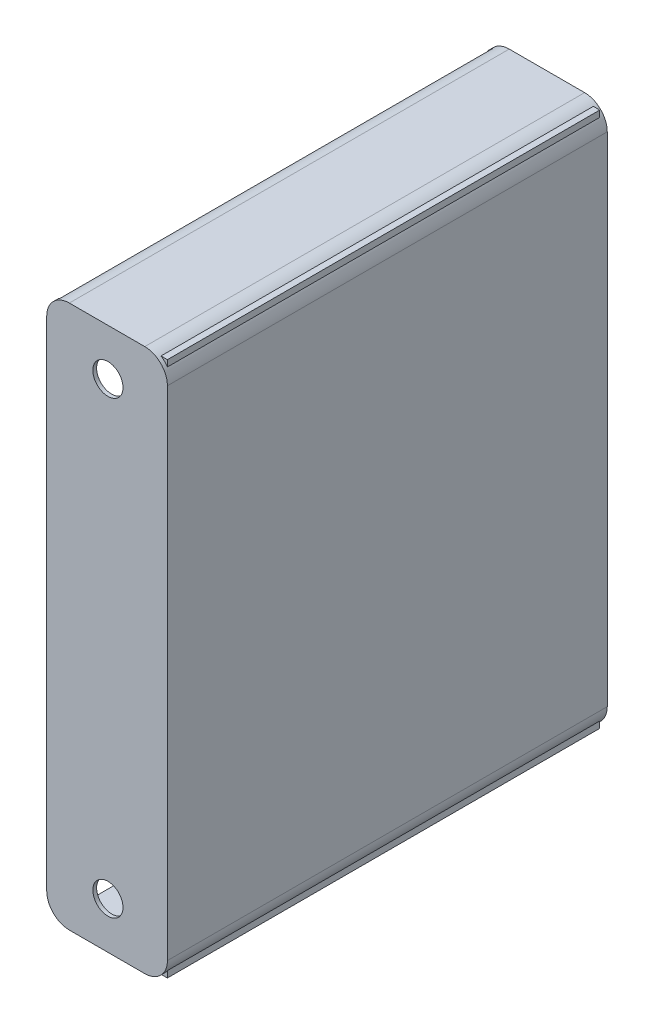
ISO-10303-21;
HEADER;
FILE_DESCRIPTION(('STEP AP214'),'2;1');
FILE_NAME('part.step','',(''),(''),'','','');
FILE_SCHEMA(('AUTOMOTIVE_DESIGN { 1 0 10303 214 1 1 1 1 }'));
ENDSEC;
DATA;
#1=APPLICATION_CONTEXT('core data for automotive mechanical design processes');
#2=APPLICATION_PROTOCOL_DEFINITION('international standard','automotive_design',2000,#1);
#3=PRODUCT_CONTEXT('',#1,'mechanical');
#4=PRODUCT('Part','Part','',(#3));
#5=PRODUCT_RELATED_PRODUCT_CATEGORY('part','',(#4));
#6=PRODUCT_DEFINITION_FORMATION('','',#4);
#7=PRODUCT_DEFINITION_CONTEXT('part definition',#1,'design');
#8=PRODUCT_DEFINITION('design','',#6,#7);
#9=PRODUCT_DEFINITION_SHAPE('','',#8);
#10=(LENGTH_UNIT() NAMED_UNIT(*) SI_UNIT(.MILLI.,.METRE.));
#11=(NAMED_UNIT(*) PLANE_ANGLE_UNIT() SI_UNIT($,.RADIAN.));
#12=(NAMED_UNIT(*) SI_UNIT($,.STERADIAN.) SOLID_ANGLE_UNIT());
#13=UNCERTAINTY_MEASURE_WITH_UNIT(LENGTH_MEASURE(1.E-05),#10,'distance_accuracy_value','');
#14=(GEOMETRIC_REPRESENTATION_CONTEXT(3) GLOBAL_UNCERTAINTY_ASSIGNED_CONTEXT((#13)) GLOBAL_UNIT_ASSIGNED_CONTEXT((#10,
#11,#12)) REPRESENTATION_CONTEXT('',''));
#15=CARTESIAN_POINT('',(0.,0.,0.));
#16=DIRECTION('',(0.,0.,1.));
#17=DIRECTION('',(1.,0.,0.));
#18=AXIS2_PLACEMENT_3D('',#15,#16,#17);
#19=CARTESIAN_POINT('',(62.8886512947952,1.10627258317078E-13,0.));
#20=DIRECTION('',(1.,0.,0.));
#21=DIRECTION('',(0.,0.,-1.));
#22=AXIS2_PLACEMENT_3D('',#19,#20,#21);
#23=PLANE('',#22);
#24=DIRECTION('',(0.,1.,0.));
#25=VECTOR('',#24,1.);
#26=CARTESIAN_POINT('',(62.8886512947952,-268.23924,-217.2737844));
#27=LINE('',#26,#25);
#28=CARTESIAN_POINT('',(62.8886512947952,-245.88597,-217.2737844));
#29=VERTEX_POINT('',#28);
#30=CARTESIAN_POINT('',(62.8886512947952,245.88597,-217.2737844));
#31=VERTEX_POINT('',#30);
#32=EDGE_CURVE('E157',#29,#31,#27,.T.);
#33=ORIENTED_EDGE('',*,*,#32,.F.);
#34=DIRECTION('',(0.,0.,-1.));
#35=VECTOR('',#34,1.);
#36=CARTESIAN_POINT('',(62.8886512947952,-245.88597,0.));
#37=LINE('',#36,#35);
#38=CARTESIAN_POINT('',(62.8886512947952,-245.88597,-213.5482394));
#39=VERTEX_POINT('',#38);
#40=EDGE_CURVE('E239',#29,#39,#37,.F.);
#41=ORIENTED_EDGE('',*,*,#40,.T.);
#42=DIRECTION('',(0.,1.,0.));
#43=VECTOR('',#42,1.);
#44=CARTESIAN_POINT('',(62.8886512947952,-268.23924,-213.5482394));
#45=LINE('',#44,#43);
#46=CARTESIAN_POINT('',(62.8886512947952,245.88597,-213.5482394));
#47=VERTEX_POINT('',#46);
#48=EDGE_CURVE('E150',#39,#47,#45,.T.);
#49=ORIENTED_EDGE('',*,*,#48,.T.);
#50=DIRECTION('',(0.,0.,1.));
#51=VECTOR('',#50,1.);
#52=CARTESIAN_POINT('',(62.8886512947952,245.88597,1.09379622367557E-13));
#53=LINE('',#52,#51);
#54=EDGE_CURVE('E233',#47,#31,#53,.F.);
#55=ORIENTED_EDGE('',*,*,#54,.T.);
#56=EDGE_LOOP('',(#33,#41,#49,#55));
#57=FACE_BOUND('',#56,.T.);
#58=ADVANCED_FACE('F34',(#57),#23,.F.);
#59=CARTESIAN_POINT('',(182.106091294795,-268.23924,217.2737844));
#60=DIRECTION('',(0.,0.,-1.));
#61=DIRECTION('',(-1.,0.,0.));
#62=AXIS2_PLACEMENT_3D('',#59,#60,#61);
#63=PLANE('',#62);
#64=CARTESIAN_POINT('',(123.343846034914,-222.355899960403,217.2737844));
#65=DIRECTION('',(0.,0.,-1.));
#66=DIRECTION('',(1.,0.,0.));
#67=AXIS2_PLACEMENT_3D('',#64,#65,#66);
#68=CIRCLE('',#67,14.90218);
#69=CARTESIAN_POINT('',(138.246026034914,-222.355899960403,217.2737844));
#70=VERTEX_POINT('',#69);
#71=EDGE_CURVE('E206',#70,#70,#68,.T.);
#72=ORIENTED_EDGE('',*,*,#71,.T.);
#73=EDGE_LOOP('',(#72));
#74=FACE_BOUND('',#73,.T.);
#75=CARTESIAN_POINT('',(123.343846034914,222.355899960404,217.2737844));
#76=DIRECTION('',(0.,0.,1.));
#77=DIRECTION('',(1.,0.,0.));
#78=AXIS2_PLACEMENT_3D('',#75,#76,#77);
#79=CIRCLE('',#78,14.90218);
#80=CARTESIAN_POINT('',(138.246026034914,222.355899960404,217.2737844));
#81=VERTEX_POINT('',#80);
#82=EDGE_CURVE('E201',#81,#81,#79,.T.);
#83=ORIENTED_EDGE('',*,*,#82,.F.);
#84=EDGE_LOOP('',(#83));
#85=FACE_BOUND('',#84,.T.);
#86=DIRECTION('',(-1.,0.,0.));
#87=VECTOR('',#86,1.);
#88=CARTESIAN_POINT('',(182.106091294795,-268.23924,217.2737844));
#89=LINE('',#88,#87);
#90=CARTESIAN_POINT('',(159.752821294795,-268.23924,217.2737844));
#91=VERTEX_POINT('',#90);
#92=CARTESIAN_POINT('',(85.2419212947952,-268.23924,217.2737844));
#93=VERTEX_POINT('',#92);
#94=EDGE_CURVE('E193',#91,#93,#89,.T.);
#95=ORIENTED_EDGE('',*,*,#94,.F.);
#96=CARTESIAN_POINT('',(159.752821294795,-245.88597,217.2737844));
#97=DIRECTION('',(0.,0.,-1.));
#98=DIRECTION('',(-1.,0.,0.));
#99=AXIS2_PLACEMENT_3D('',#96,#97,#98);
#100=CIRCLE('',#99,22.35327);
#101=CARTESIAN_POINT('',(182.106091294795,-245.88597,217.2737844));
#102=VERTEX_POINT('',#101);
#103=EDGE_CURVE('E231',#91,#102,#100,.F.);
#104=ORIENTED_EDGE('',*,*,#103,.T.);
#105=DIRECTION('',(0.,-1.,0.));
#106=VECTOR('',#105,1.);
#107=CARTESIAN_POINT('',(182.106091294795,-268.23924,217.2737844));
#108=LINE('',#107,#106);
#109=CARTESIAN_POINT('',(182.106091294795,245.88597,217.2737844));
#110=VERTEX_POINT('',#109);
#111=EDGE_CURVE('E176',#110,#102,#108,.T.);
#112=ORIENTED_EDGE('',*,*,#111,.F.);
#113=CARTESIAN_POINT('',(159.752821294795,245.88597,217.2737844));
#114=DIRECTION('',(0.,0.,-1.));
#115=DIRECTION('',(-1.,0.,0.));
#116=AXIS2_PLACEMENT_3D('',#113,#114,#115);
#117=CIRCLE('',#116,22.35327);
#118=CARTESIAN_POINT('',(159.752821294795,268.23924,217.2737844));
#119=VERTEX_POINT('',#118);
#120=EDGE_CURVE('E227',#110,#119,#117,.F.);
#121=ORIENTED_EDGE('',*,*,#120,.T.);
#122=DIRECTION('',(-1.,0.,0.));
#123=VECTOR('',#122,1.);
#124=CARTESIAN_POINT('',(182.106091294795,268.23924,217.2737844));
#125=LINE('',#124,#123);
#126=CARTESIAN_POINT('',(85.2419212947952,268.23924,217.2737844));
#127=VERTEX_POINT('',#126);
#128=EDGE_CURVE('E181',#119,#127,#125,.T.);
#129=ORIENTED_EDGE('',*,*,#128,.T.);
#130=CARTESIAN_POINT('',(85.2419212947952,245.88597,217.2737844));
#131=DIRECTION('',(0.,0.,-1.));
#132=DIRECTION('',(-1.,0.,0.));
#133=AXIS2_PLACEMENT_3D('',#130,#131,#132);
#134=CIRCLE('',#133,22.35327);
#135=CARTESIAN_POINT('',(62.8886512947952,245.88597,217.2737844));
#136=VERTEX_POINT('',#135);
#137=EDGE_CURVE('E225',#127,#136,#134,.F.);
#138=ORIENTED_EDGE('',*,*,#137,.T.);
#139=DIRECTION('',(0.,-1.,0.));
#140=VECTOR('',#139,1.);
#141=CARTESIAN_POINT('',(62.8886512947952,-268.23924,217.2737844));
#142=LINE('',#141,#140);
#143=CARTESIAN_POINT('',(62.8886512947952,-245.88597,217.2737844));
#144=VERTEX_POINT('',#143);
#145=EDGE_CURVE('E153',#136,#144,#142,.T.);
#146=ORIENTED_EDGE('',*,*,#145,.T.);
#147=CARTESIAN_POINT('',(85.2419212947952,-245.88597,217.2737844));
#148=DIRECTION('',(0.,0.,-1.));
#149=DIRECTION('',(-1.,0.,0.));
#150=AXIS2_PLACEMENT_3D('',#147,#148,#149);
#151=CIRCLE('',#150,22.35327);
#152=EDGE_CURVE('E229',#144,#93,#151,.F.);
#153=ORIENTED_EDGE('',*,*,#152,.T.);
#154=EDGE_LOOP('',(#95,#104,#112,#121,#129,#138,#146,#153));
#155=FACE_BOUND('',#154,.T.);
#156=ADVANCED_FACE('F271',(#74,#85,#155),#63,.F.);
#157=CARTESIAN_POINT('',(182.106091294795,-268.23924,-217.2737844));
#158=DIRECTION('',(0.,1.,0.));
#159=DIRECTION('',(0.,0.,1.));
#160=AXIS2_PLACEMENT_3D('',#157,#158,#159);
#161=PLANE('',#160);
#162=DIRECTION('',(-1.,0.,0.));
#163=VECTOR('',#162,1.);
#164=CARTESIAN_POINT('',(182.106091294795,-268.23924,-217.2737844));
#165=LINE('',#164,#163);
#166=CARTESIAN_POINT('',(159.752821294795,-268.23924,-217.2737844));
#167=VERTEX_POINT('',#166);
#168=CARTESIAN_POINT('',(85.2419212947952,-268.23924,-217.2737844));
#169=VERTEX_POINT('',#168);
#170=EDGE_CURVE('E190',#167,#169,#165,.T.);
#171=ORIENTED_EDGE('',*,*,#170,.F.);
#172=DIRECTION('',(0.,0.,-1.));
#173=VECTOR('',#172,1.);
#174=CARTESIAN_POINT('',(159.752821294795,-268.23924,217.2737844));
#175=LINE('',#174,#173);
#176=EDGE_CURVE('E223',#167,#91,#175,.F.);
#177=ORIENTED_EDGE('',*,*,#176,.T.);
#178=ORIENTED_EDGE('',*,*,#94,.T.);
#179=DIRECTION('',(0.,0.,-1.));
#180=VECTOR('',#179,1.);
#181=CARTESIAN_POINT('',(85.2419212947952,-268.23924,-217.2737844));
#182=LINE('',#181,#180);
#183=EDGE_CURVE('E220',#93,#169,#182,.T.);
#184=ORIENTED_EDGE('',*,*,#183,.T.);
#185=EDGE_LOOP('',(#171,#177,#178,#184));
#186=FACE_BOUND('',#185,.T.);
#187=ADVANCED_FACE('F278',(#186),#161,.F.);
#188=CARTESIAN_POINT('',(182.106091294795,-268.23924,-217.2737844));
#189=DIRECTION('',(0.,0.,1.));
#190=DIRECTION('',(1.,0.,0.));
#191=AXIS2_PLACEMENT_3D('',#188,#189,#190);
#192=PLANE('',#191);
#193=CARTESIAN_POINT('',(123.343846034914,-222.355899960403,-217.2737844));
#194=DIRECTION('',(0.,0.,1.));
#195=DIRECTION('',(1.,0.,0.));
#196=AXIS2_PLACEMENT_3D('',#193,#194,#195);
#197=CIRCLE('',#196,14.90218);
#198=CARTESIAN_POINT('',(138.246026034914,-222.355899960403,-217.2737844));
#199=VERTEX_POINT('',#198);
#200=EDGE_CURVE('E358',#199,#199,#197,.F.);
#201=ORIENTED_EDGE('',*,*,#200,.F.);
#202=EDGE_LOOP('',(#201));
#203=FACE_BOUND('',#202,.T.);
#204=CARTESIAN_POINT('',(123.343846034914,222.355899960404,-217.2737844));
#205=DIRECTION('',(0.,0.,1.));
#206=DIRECTION('',(1.,0.,0.));
#207=AXIS2_PLACEMENT_3D('',#204,#205,#206);
#208=CIRCLE('',#207,14.90218);
#209=CARTESIAN_POINT('',(138.246026034914,222.355899960404,-217.2737844));
#210=VERTEX_POINT('',#209);
#211=EDGE_CURVE('E162',#210,#210,#208,.T.);
#212=ORIENTED_EDGE('',*,*,#211,.T.);
#213=EDGE_LOOP('',(#212));
#214=FACE_BOUND('',#213,.T.);
#215=DIRECTION('',(0.,1.,0.));
#216=VECTOR('',#215,1.);
#217=CARTESIAN_POINT('',(182.106091294795,-268.23924,-217.2737844));
#218=LINE('',#217,#216);
#219=CARTESIAN_POINT('',(182.106091294795,-245.88597,-217.2737844));
#220=VERTEX_POINT('',#219);
#221=CARTESIAN_POINT('',(182.106091294795,245.88597,-217.2737844));
#222=VERTEX_POINT('',#221);
#223=EDGE_CURVE('E179',#220,#222,#218,.T.);
#224=ORIENTED_EDGE('',*,*,#223,.F.);
#225=CARTESIAN_POINT('',(159.752821294795,-245.88597,-217.2737844));
#226=DIRECTION('',(0.,0.,1.));
#227=DIRECTION('',(1.,0.,0.));
#228=AXIS2_PLACEMENT_3D('',#225,#226,#227);
#229=CIRCLE('',#228,22.35327);
#230=EDGE_CURVE('E218',#220,#167,#229,.F.);
#231=ORIENTED_EDGE('',*,*,#230,.T.);
#232=ORIENTED_EDGE('',*,*,#170,.T.);
#233=CARTESIAN_POINT('',(85.2419212947952,-245.88597,-217.2737844));
#234=DIRECTION('',(0.,0.,1.));
#235=DIRECTION('',(1.,0.,0.));
#236=AXIS2_PLACEMENT_3D('',#233,#234,#235);
#237=CIRCLE('',#236,22.35327);
#238=EDGE_CURVE('E216',#169,#29,#237,.F.);
#239=ORIENTED_EDGE('',*,*,#238,.T.);
#240=ORIENTED_EDGE('',*,*,#32,.T.);
#241=CARTESIAN_POINT('',(85.2419212947952,245.88597,-217.2737844));
#242=DIRECTION('',(0.,0.,1.));
#243=DIRECTION('',(1.,0.,0.));
#244=AXIS2_PLACEMENT_3D('',#241,#242,#243);
#245=CIRCLE('',#244,22.35327);
#246=CARTESIAN_POINT('',(85.2419212947952,268.23924,-217.2737844));
#247=VERTEX_POINT('',#246);
#248=EDGE_CURVE('E212',#31,#247,#245,.F.);
#249=ORIENTED_EDGE('',*,*,#248,.T.);
#250=DIRECTION('',(-1.,0.,0.));
#251=VECTOR('',#250,1.);
#252=CARTESIAN_POINT('',(182.106091294795,268.23924,-217.2737844));
#253=LINE('',#252,#251);
#254=CARTESIAN_POINT('',(159.752821294795,268.23924,-217.2737844));
#255=VERTEX_POINT('',#254);
#256=EDGE_CURVE('E187',#255,#247,#253,.T.);
#257=ORIENTED_EDGE('',*,*,#256,.F.);
#258=CARTESIAN_POINT('',(159.752821294795,245.88597,-217.2737844));
#259=DIRECTION('',(0.,0.,1.));
#260=DIRECTION('',(1.,0.,0.));
#261=AXIS2_PLACEMENT_3D('',#258,#259,#260);
#262=CIRCLE('',#261,22.35327);
#263=EDGE_CURVE('E214',#255,#222,#262,.F.);
#264=ORIENTED_EDGE('',*,*,#263,.T.);
#265=EDGE_LOOP('',(#224,#231,#232,#239,#240,#249,#257,#264));
#266=FACE_BOUND('',#265,.T.);
#267=ADVANCED_FACE('F261',(#203,#214,#266),#192,.F.);
#268=CARTESIAN_POINT('',(182.106091294795,268.23924,-217.2737844));
#269=DIRECTION('',(0.,-1.,0.));
#270=DIRECTION('',(0.,0.,-1.));
#271=AXIS2_PLACEMENT_3D('',#268,#269,#270);
#272=PLANE('',#271);
#273=ORIENTED_EDGE('',*,*,#128,.F.);
#274=DIRECTION('',(0.,0.,1.));
#275=VECTOR('',#274,1.);
#276=CARTESIAN_POINT('',(159.752821294795,268.23924,-217.2737844));
#277=LINE('',#276,#275);
#278=EDGE_CURVE('E42',#119,#255,#277,.F.);
#279=ORIENTED_EDGE('',*,*,#278,.T.);
#280=ORIENTED_EDGE('',*,*,#256,.T.);
#281=DIRECTION('',(0.,0.,1.));
#282=VECTOR('',#281,1.);
#283=CARTESIAN_POINT('',(85.2419212947952,268.23924,-217.2737844));
#284=LINE('',#283,#282);
#285=EDGE_CURVE('E249',#247,#127,#284,.T.);
#286=ORIENTED_EDGE('',*,*,#285,.T.);
#287=EDGE_LOOP('',(#273,#279,#280,#286));
#288=FACE_BOUND('',#287,.T.);
#289=ADVANCED_FACE('F255',(#288),#272,.F.);
#290=CARTESIAN_POINT('',(182.106091294795,1.10627258317078E-13,0.));
#291=DIRECTION('',(1.,0.,0.));
#292=DIRECTION('',(0.,0.,-1.));
#293=AXIS2_PLACEMENT_3D('',#290,#291,#292);
#294=PLANE('',#293);
#295=ORIENTED_EDGE('',*,*,#111,.T.);
#296=DIRECTION('',(0.,0.,-1.));
#297=VECTOR('',#296,1.);
#298=CARTESIAN_POINT('',(182.106091294795,-245.88597,-217.2737844));
#299=LINE('',#298,#297);
#300=EDGE_CURVE('E209',#102,#220,#299,.T.);
#301=ORIENTED_EDGE('',*,*,#300,.T.);
#302=ORIENTED_EDGE('',*,*,#223,.T.);
#303=DIRECTION('',(0.,0.,1.));
#304=VECTOR('',#303,1.);
#305=CARTESIAN_POINT('',(182.106091294795,245.88597,217.2737844));
#306=LINE('',#305,#304);
#307=EDGE_CURVE('E196',#222,#110,#306,.T.);
#308=ORIENTED_EDGE('',*,*,#307,.T.);
#309=EDGE_LOOP('',(#295,#301,#302,#308));
#310=FACE_BOUND('',#309,.T.);
#311=ADVANCED_FACE('F267',(#310),#294,.T.);
#312=DIRECTION('',(0.,-1.,0.));
#313=VECTOR('',#312,1.);
#314=CARTESIAN_POINT('',(62.8886512947952,-268.23924,213.5482394));
#315=LINE('',#314,#313);
#316=CARTESIAN_POINT('',(62.8886512947952,245.88597,213.5482394));
#317=VERTEX_POINT('',#316);
#318=CARTESIAN_POINT('',(62.8886512947952,-245.88597,213.5482394));
#319=VERTEX_POINT('',#318);
#320=EDGE_CURVE('E171',#317,#319,#315,.T.);
#321=ORIENTED_EDGE('',*,*,#320,.T.);
#322=DIRECTION('',(0.,0.,-1.));
#323=VECTOR('',#322,1.);
#324=CARTESIAN_POINT('',(62.8886512947952,-245.88597,0.));
#325=LINE('',#324,#323);
#326=EDGE_CURVE('E237',#319,#144,#325,.F.);
#327=ORIENTED_EDGE('',*,*,#326,.T.);
#328=ORIENTED_EDGE('',*,*,#145,.F.);
#329=DIRECTION('',(0.,0.,1.));
#330=VECTOR('',#329,1.);
#331=CARTESIAN_POINT('',(62.8886512947952,245.88597,1.09379622367557E-13));
#332=LINE('',#331,#330);
#333=EDGE_CURVE('E235',#136,#317,#332,.F.);
#334=ORIENTED_EDGE('',*,*,#333,.T.);
#335=EDGE_LOOP('',(#321,#327,#328,#334));
#336=FACE_BOUND('',#335,.T.);
#337=ADVANCED_FACE('F296',(#336),#23,.F.);
#338=CARTESIAN_POINT('',(182.106091294795,-268.23924,213.5482394));
#339=DIRECTION('',(0.,0.,-1.));
#340=DIRECTION('',(-1.,0.,0.));
#341=AXIS2_PLACEMENT_3D('',#338,#339,#340);
#342=PLANE('',#341);
#343=CARTESIAN_POINT('',(123.343846034914,-222.355899960403,213.5482394));
#344=DIRECTION('',(0.,0.,-1.));
#345=DIRECTION('',(-1.,0.,0.));
#346=AXIS2_PLACEMENT_3D('',#343,#344,#345);
#347=CIRCLE('',#346,14.90218);
#348=CARTESIAN_POINT('',(108.441666034914,-222.355899960403,213.5482394));
#349=VERTEX_POINT('',#348);
#350=EDGE_CURVE('E205',#349,#349,#347,.F.);
#351=ORIENTED_EDGE('',*,*,#350,.T.);
#352=EDGE_LOOP('',(#351));
#353=FACE_BOUND('',#352,.T.);
#354=CARTESIAN_POINT('',(123.343846034914,222.355899960404,213.5482394));
#355=DIRECTION('',(0.,0.,-1.));
#356=DIRECTION('',(-1.,0.,0.));
#357=AXIS2_PLACEMENT_3D('',#354,#355,#356);
#358=CIRCLE('',#357,14.90218);
#359=CARTESIAN_POINT('',(108.441666034914,222.355899960404,213.5482394));
#360=VERTEX_POINT('',#359);
#361=EDGE_CURVE('E200',#360,#360,#358,.T.);
#362=ORIENTED_EDGE('',*,*,#361,.F.);
#363=EDGE_LOOP('',(#362));
#364=FACE_BOUND('',#363,.T.);
#365=DIRECTION('',(-1.,0.,0.));
#366=VECTOR('',#365,1.);
#367=CARTESIAN_POINT('',(182.106091294795,-264.513695,213.5482394));
#368=LINE('',#367,#366);
#369=CARTESIAN_POINT('',(178.380546294795,-264.513695,213.5482394));
#370=VERTEX_POINT('',#369);
#371=CARTESIAN_POINT('',(72.8856863902106,-264.513695,213.5482394));
#372=VERTEX_POINT('',#371);
#373=EDGE_CURVE('E147',#370,#372,#368,.T.);
#374=ORIENTED_EDGE('',*,*,#373,.T.);
#375=CARTESIAN_POINT('',(85.2419212947952,-245.88597,213.5482394));
#376=DIRECTION('',(0.,0.,-1.));
#377=DIRECTION('',(-1.,0.,0.));
#378=AXIS2_PLACEMENT_3D('',#375,#376,#377);
#379=CIRCLE('',#378,22.35327);
#380=EDGE_CURVE('E247',#372,#319,#379,.T.);
#381=ORIENTED_EDGE('',*,*,#380,.T.);
#382=ORIENTED_EDGE('',*,*,#320,.F.);
#383=CARTESIAN_POINT('',(85.2419212947952,245.88597,213.5482394));
#384=DIRECTION('',(0.,0.,-1.));
#385=DIRECTION('',(-1.,0.,0.));
#386=AXIS2_PLACEMENT_3D('',#383,#384,#385);
#387=CIRCLE('',#386,22.35327);
#388=CARTESIAN_POINT('',(72.8856863902105,264.513695,213.5482394));
#389=VERTEX_POINT('',#388);
#390=EDGE_CURVE('E49',#317,#389,#387,.T.);
#391=ORIENTED_EDGE('',*,*,#390,.T.);
#392=DIRECTION('',(-1.,0.,0.));
#393=VECTOR('',#392,1.);
#394=CARTESIAN_POINT('',(182.106091294795,264.513695,213.5482394));
#395=LINE('',#394,#393);
#396=CARTESIAN_POINT('',(178.380546294795,264.513695,213.5482394));
#397=VERTEX_POINT('',#396);
#398=EDGE_CURVE('E149',#397,#389,#395,.T.);
#399=ORIENTED_EDGE('',*,*,#398,.F.);
#400=DIRECTION('',(0.,-1.,0.));
#401=VECTOR('',#400,1.);
#402=CARTESIAN_POINT('',(178.380546294795,-268.23924,213.5482394));
#403=LINE('',#402,#401);
#404=EDGE_CURVE('E142',#397,#370,#403,.T.);
#405=ORIENTED_EDGE('',*,*,#404,.T.);
#406=EDGE_LOOP('',(#374,#381,#382,#391,#399,#405));
#407=FACE_BOUND('',#406,.T.);
#408=ADVANCED_FACE('F146',(#353,#364,#407),#342,.T.);
#409=CARTESIAN_POINT('',(182.106091294795,-264.513695,-217.2737844));
#410=DIRECTION('',(0.,1.,0.));
#411=DIRECTION('',(0.,0.,1.));
#412=AXIS2_PLACEMENT_3D('',#409,#410,#411);
#413=PLANE('',#412);
#414=DIRECTION('',(-1.,0.,0.));
#415=VECTOR('',#414,1.);
#416=CARTESIAN_POINT('',(182.106091294795,-264.513695,-213.5482394));
#417=LINE('',#416,#415);
#418=CARTESIAN_POINT('',(178.380546294795,-264.513695,-213.5482394));
#419=VERTEX_POINT('',#418);
#420=CARTESIAN_POINT('',(72.8856863902106,-264.513695,-213.5482394));
#421=VERTEX_POINT('',#420);
#422=EDGE_CURVE('E154',#419,#421,#417,.T.);
#423=ORIENTED_EDGE('',*,*,#422,.T.);
#424=DIRECTION('',(0.,0.,-1.));
#425=VECTOR('',#424,1.);
#426=CARTESIAN_POINT('',(72.8856863902106,-264.513695,-213.5482394));
#427=LINE('',#426,#425);
#428=EDGE_CURVE('E57',#421,#372,#427,.F.);
#429=ORIENTED_EDGE('',*,*,#428,.T.);
#430=ORIENTED_EDGE('',*,*,#373,.F.);
#431=DIRECTION('',(0.,0.,-1.));
#432=VECTOR('',#431,1.);
#433=CARTESIAN_POINT('',(178.380546294795,-264.513695,-217.2737844));
#434=LINE('',#433,#432);
#435=EDGE_CURVE('E138',#370,#419,#434,.T.);
#436=ORIENTED_EDGE('',*,*,#435,.T.);
#437=EDGE_LOOP('',(#423,#429,#430,#436));
#438=FACE_BOUND('',#437,.T.);
#439=ADVANCED_FACE('F152',(#438),#413,.T.);
#440=CARTESIAN_POINT('',(182.106091294795,-268.23924,-213.5482394));
#441=DIRECTION('',(0.,0.,1.));
#442=DIRECTION('',(1.,0.,0.));
#443=AXIS2_PLACEMENT_3D('',#440,#441,#442);
#444=PLANE('',#443);
#445=CARTESIAN_POINT('',(123.343846034914,-222.355899960403,-213.5482394));
#446=DIRECTION('',(0.,0.,1.));
#447=DIRECTION('',(1.,0.,0.));
#448=AXIS2_PLACEMENT_3D('',#445,#446,#447);
#449=CIRCLE('',#448,14.90218);
#450=CARTESIAN_POINT('',(138.246026034914,-222.355899960403,-213.5482394));
#451=VERTEX_POINT('',#450);
#452=EDGE_CURVE('E202',#451,#451,#449,.F.);
#453=ORIENTED_EDGE('',*,*,#452,.T.);
#454=EDGE_LOOP('',(#453));
#455=FACE_BOUND('',#454,.T.);
#456=CARTESIAN_POINT('',(123.343846034914,222.355899960404,-213.5482394));
#457=DIRECTION('',(0.,0.,1.));
#458=DIRECTION('',(1.,0.,0.));
#459=AXIS2_PLACEMENT_3D('',#456,#457,#458);
#460=CIRCLE('',#459,14.90218);
#461=CARTESIAN_POINT('',(138.246026034914,222.355899960404,-213.5482394));
#462=VERTEX_POINT('',#461);
#463=EDGE_CURVE('E197',#462,#462,#460,.T.);
#464=ORIENTED_EDGE('',*,*,#463,.F.);
#465=EDGE_LOOP('',(#464));
#466=FACE_BOUND('',#465,.T.);
#467=ORIENTED_EDGE('',*,*,#48,.F.);
#468=CARTESIAN_POINT('',(85.2419212947952,-245.88597,-213.5482394));
#469=DIRECTION('',(0.,0.,1.));
#470=DIRECTION('',(1.,0.,0.));
#471=AXIS2_PLACEMENT_3D('',#468,#469,#470);
#472=CIRCLE('',#471,22.35327);
#473=EDGE_CURVE('E243',#39,#421,#472,.T.);
#474=ORIENTED_EDGE('',*,*,#473,.T.);
#475=ORIENTED_EDGE('',*,*,#422,.F.);
#476=DIRECTION('',(0.,1.,0.));
#477=VECTOR('',#476,1.);
#478=CARTESIAN_POINT('',(178.380546294795,-268.23924,-213.5482394));
#479=LINE('',#478,#477);
#480=CARTESIAN_POINT('',(178.380546294795,264.513695,-213.5482394));
#481=VERTEX_POINT('',#480);
#482=EDGE_CURVE('E143',#419,#481,#479,.T.);
#483=ORIENTED_EDGE('',*,*,#482,.T.);
#484=DIRECTION('',(-1.,0.,0.));
#485=VECTOR('',#484,1.);
#486=CARTESIAN_POINT('',(182.106091294795,264.513695,-213.5482394));
#487=LINE('',#486,#485);
#488=CARTESIAN_POINT('',(72.8856863902106,264.513695,-213.5482394));
#489=VERTEX_POINT('',#488);
#490=EDGE_CURVE('E159',#481,#489,#487,.T.);
#491=ORIENTED_EDGE('',*,*,#490,.T.);
#492=CARTESIAN_POINT('',(85.2419212947952,245.88597,-213.5482394));
#493=DIRECTION('',(0.,0.,1.));
#494=DIRECTION('',(1.,0.,0.));
#495=AXIS2_PLACEMENT_3D('',#492,#493,#494);
#496=CIRCLE('',#495,22.35327);
#497=EDGE_CURVE('E241',#489,#47,#496,.T.);
#498=ORIENTED_EDGE('',*,*,#497,.T.);
#499=EDGE_LOOP('',(#467,#474,#475,#483,#491,#498));
#500=FACE_BOUND('',#499,.T.);
#501=ADVANCED_FACE('F301',(#455,#466,#500),#444,.T.);
#502=CARTESIAN_POINT('',(182.106091294795,264.513695,-217.2737844));
#503=DIRECTION('',(0.,-1.,0.));
#504=DIRECTION('',(0.,0.,-1.));
#505=AXIS2_PLACEMENT_3D('',#502,#503,#504);
#506=PLANE('',#505);
#507=ORIENTED_EDGE('',*,*,#398,.T.);
#508=DIRECTION('',(0.,0.,1.));
#509=VECTOR('',#508,1.);
#510=CARTESIAN_POINT('',(72.8856863902105,264.513695,213.5482394));
#511=LINE('',#510,#509);
#512=EDGE_CURVE('E11',#389,#489,#511,.F.);
#513=ORIENTED_EDGE('',*,*,#512,.T.);
#514=ORIENTED_EDGE('',*,*,#490,.F.);
#515=DIRECTION('',(0.,0.,1.));
#516=VECTOR('',#515,1.);
#517=CARTESIAN_POINT('',(178.380546294795,264.513695,-217.2737844));
#518=LINE('',#517,#516);
#519=EDGE_CURVE('E165',#481,#397,#518,.T.);
#520=ORIENTED_EDGE('',*,*,#519,.T.);
#521=EDGE_LOOP('',(#507,#513,#514,#520));
#522=FACE_BOUND('',#521,.T.);
#523=ADVANCED_FACE('F299',(#522),#506,.T.);
#524=CARTESIAN_POINT('',(178.380546294795,1.10627258317078E-13,0.));
#525=DIRECTION('',(1.,0.,0.));
#526=DIRECTION('',(0.,0.,-1.));
#527=AXIS2_PLACEMENT_3D('',#524,#525,#526);
#528=PLANE('',#527);
#529=ORIENTED_EDGE('',*,*,#404,.F.);
#530=ORIENTED_EDGE('',*,*,#519,.F.);
#531=ORIENTED_EDGE('',*,*,#482,.F.);
#532=ORIENTED_EDGE('',*,*,#435,.F.);
#533=EDGE_LOOP('',(#529,#530,#531,#532));
#534=FACE_BOUND('',#533,.T.);
#535=ADVANCED_FACE('F140',(#534),#528,.F.);
#536=CARTESIAN_POINT('',(123.343846034914,222.355899960404,-283.5884854));
#537=DIRECTION('',(0.,0.,1.));
#538=DIRECTION('',(1.,0.,0.));
#539=AXIS2_PLACEMENT_3D('',#536,#537,#538);
#540=CYLINDRICAL_SURFACE('',#539,14.90218);
#541=ORIENTED_EDGE('',*,*,#463,.T.);
#542=EDGE_LOOP('',(#541));
#543=FACE_BOUND('',#542,.T.);
#544=ORIENTED_EDGE('',*,*,#211,.F.);
#545=EDGE_LOOP('',(#544));
#546=FACE_BOUND('',#545,.T.);
#547=ADVANCED_FACE('F333',(#543,#546),#540,.F.);
#548=ORIENTED_EDGE('',*,*,#361,.T.);
#549=EDGE_LOOP('',(#548));
#550=FACE_BOUND('',#549,.T.);
#551=ORIENTED_EDGE('',*,*,#82,.T.);
#552=EDGE_LOOP('',(#551));
#553=FACE_BOUND('',#552,.T.);
#554=ADVANCED_FACE('F337',(#550,#553),#540,.F.);
#555=CARTESIAN_POINT('',(123.343846034914,-222.355899960403,-283.5884854));
#556=DIRECTION('',(0.,0.,1.));
#557=DIRECTION('',(1.,0.,0.));
#558=AXIS2_PLACEMENT_3D('',#555,#556,#557);
#559=CYLINDRICAL_SURFACE('',#558,14.90218);
#560=ORIENTED_EDGE('',*,*,#452,.F.);
#561=EDGE_LOOP('',(#560));
#562=FACE_BOUND('',#561,.T.);
#563=ORIENTED_EDGE('',*,*,#200,.T.);
#564=EDGE_LOOP('',(#563));
#565=FACE_BOUND('',#564,.T.);
#566=ADVANCED_FACE('F343',(#562,#565),#559,.F.);
#567=ORIENTED_EDGE('',*,*,#350,.F.);
#568=EDGE_LOOP('',(#567));
#569=FACE_BOUND('',#568,.T.);
#570=ORIENTED_EDGE('',*,*,#71,.F.);
#571=EDGE_LOOP('',(#570));
#572=FACE_BOUND('',#571,.T.);
#573=ADVANCED_FACE('F348',(#569,#572),#559,.F.);
#574=CARTESIAN_POINT('',(159.752821294795,-245.88597,0.));
#575=DIRECTION('',(0.,0.,1.));
#576=DIRECTION('',(0.,-1.,0.));
#577=AXIS2_PLACEMENT_3D('',#574,#575,#576);
#578=CYLINDRICAL_SURFACE('',#577,22.35327);
#579=ORIENTED_EDGE('',*,*,#103,.F.);
#580=ORIENTED_EDGE('',*,*,#176,.F.);
#581=ORIENTED_EDGE('',*,*,#230,.F.);
#582=ORIENTED_EDGE('',*,*,#300,.F.);
#583=EDGE_LOOP('',(#579,#580,#581,#582));
#584=FACE_BOUND('',#583,.T.);
#585=ADVANCED_FACE('F275',(#584),#578,.T.);
#586=CARTESIAN_POINT('',(85.2419212947952,-245.88597,-217.2737844));
#587=DIRECTION('',(0.,0.,-1.));
#588=DIRECTION('',(0.,1.,0.));
#589=AXIS2_PLACEMENT_3D('',#586,#587,#588);
#590=CYLINDRICAL_SURFACE('',#589,22.35327);
#591=ORIENTED_EDGE('',*,*,#473,.F.);
#592=ORIENTED_EDGE('',*,*,#40,.F.);
#593=ORIENTED_EDGE('',*,*,#238,.F.);
#594=ORIENTED_EDGE('',*,*,#183,.F.);
#595=ORIENTED_EDGE('',*,*,#152,.F.);
#596=ORIENTED_EDGE('',*,*,#326,.F.);
#597=ORIENTED_EDGE('',*,*,#380,.F.);
#598=ORIENTED_EDGE('',*,*,#428,.F.);
#599=EDGE_LOOP('',(#591,#592,#593,#594,#595,#596,#597,#598));
#600=FACE_BOUND('',#599,.T.);
#601=ADVANCED_FACE('F283',(#600),#590,.T.);
#602=CARTESIAN_POINT('',(159.752821294795,245.88597,1.09379622367557E-13));
#603=DIRECTION('',(0.,0.,-1.));
#604=DIRECTION('',(0.,1.,0.));
#605=AXIS2_PLACEMENT_3D('',#602,#603,#604);
#606=CYLINDRICAL_SURFACE('',#605,22.35327);
#607=ORIENTED_EDGE('',*,*,#263,.F.);
#608=ORIENTED_EDGE('',*,*,#278,.F.);
#609=ORIENTED_EDGE('',*,*,#120,.F.);
#610=ORIENTED_EDGE('',*,*,#307,.F.);
#611=EDGE_LOOP('',(#607,#608,#609,#610));
#612=FACE_BOUND('',#611,.T.);
#613=ADVANCED_FACE('F264',(#612),#606,.T.);
#614=CARTESIAN_POINT('',(85.2419212947952,245.88597,-217.2737844));
#615=DIRECTION('',(0.,0.,1.));
#616=DIRECTION('',(0.,-1.,0.));
#617=AXIS2_PLACEMENT_3D('',#614,#615,#616);
#618=CYLINDRICAL_SURFACE('',#617,22.35327);
#619=ORIENTED_EDGE('',*,*,#390,.F.);
#620=ORIENTED_EDGE('',*,*,#333,.F.);
#621=ORIENTED_EDGE('',*,*,#137,.F.);
#622=ORIENTED_EDGE('',*,*,#285,.F.);
#623=ORIENTED_EDGE('',*,*,#248,.F.);
#624=ORIENTED_EDGE('',*,*,#54,.F.);
#625=ORIENTED_EDGE('',*,*,#497,.F.);
#626=ORIENTED_EDGE('',*,*,#512,.F.);
#627=EDGE_LOOP('',(#619,#620,#621,#622,#623,#624,#625,#626));
#628=FACE_BOUND('',#627,.T.);
#629=ADVANCED_FACE('F36',(#628),#618,.T.);
#630=CLOSED_SHELL('',(#58,#156,#187,#267,#289,#311,#337,#408,#439,#501,#523,#535,#547,#554,#566,
#573,#585,#601,#613,#629));
#631=MANIFOLD_SOLID_BREP('B2',#630);
#632=ADVANCED_BREP_SHAPE_REPRESENTATION('',(#18,#631),#14);
#633=SHAPE_DEFINITION_REPRESENTATION(#9,#632);
ENDSEC;
END-ISO-10303-21;
